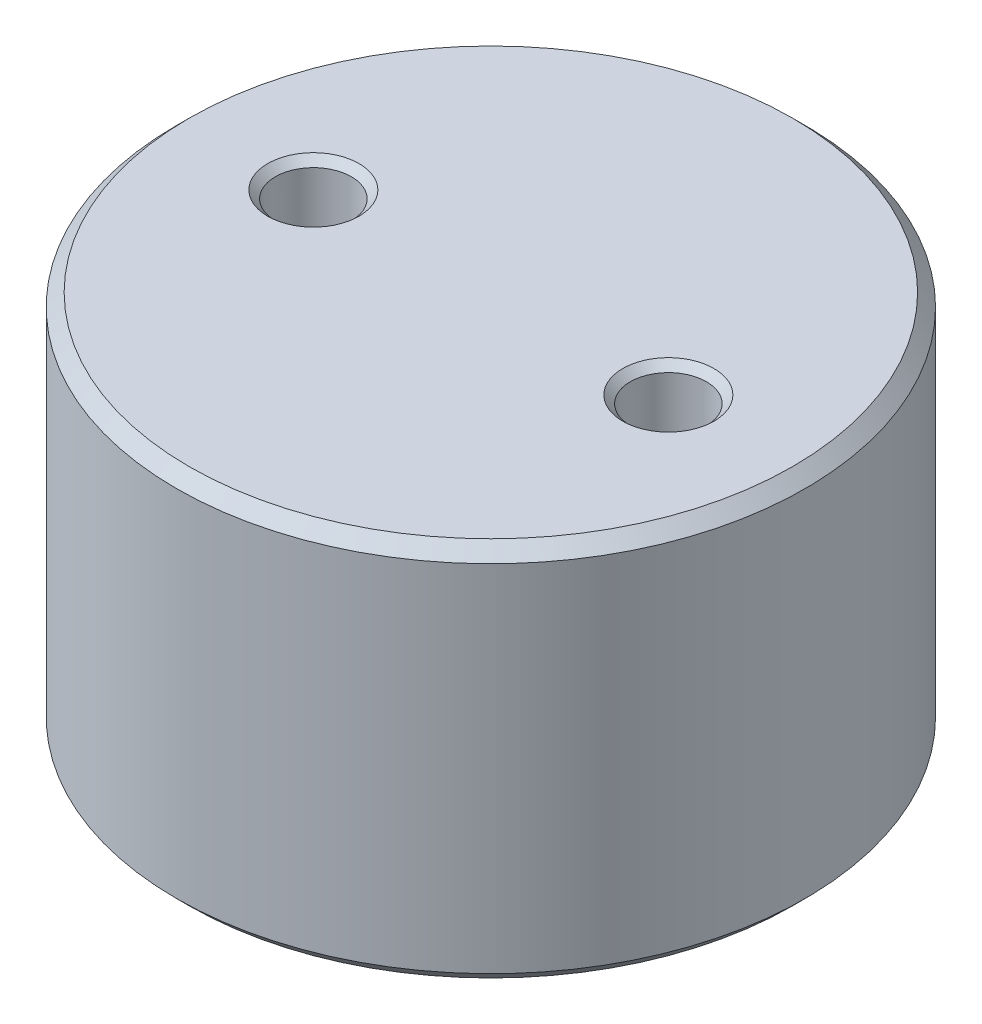
ISO-10303-21;
HEADER;
FILE_DESCRIPTION(('STEP AP214'),'2;1');
FILE_NAME('part.step','',(''),(''),'','','');
FILE_SCHEMA(('AUTOMOTIVE_DESIGN { 1 0 10303 214 1 1 1 1 }'));
ENDSEC;
DATA;
#1=APPLICATION_CONTEXT('core data for automotive mechanical design processes');
#2=APPLICATION_PROTOCOL_DEFINITION('international standard','automotive_design',2000,#1);
#3=PRODUCT_CONTEXT('',#1,'mechanical');
#4=PRODUCT('Part','Part','',(#3));
#5=PRODUCT_RELATED_PRODUCT_CATEGORY('part','',(#4));
#6=PRODUCT_DEFINITION_FORMATION('','',#4);
#7=PRODUCT_DEFINITION_CONTEXT('part definition',#1,'design');
#8=PRODUCT_DEFINITION('design','',#6,#7);
#9=PRODUCT_DEFINITION_SHAPE('','',#8);
#10=(LENGTH_UNIT() NAMED_UNIT(*) SI_UNIT(.MILLI.,.METRE.));
#11=(NAMED_UNIT(*) PLANE_ANGLE_UNIT() SI_UNIT($,.RADIAN.));
#12=(NAMED_UNIT(*) SI_UNIT($,.STERADIAN.) SOLID_ANGLE_UNIT());
#13=UNCERTAINTY_MEASURE_WITH_UNIT(LENGTH_MEASURE(1.E-05),#10,'distance_accuracy_value','');
#14=(GEOMETRIC_REPRESENTATION_CONTEXT(3) GLOBAL_UNCERTAINTY_ASSIGNED_CONTEXT((#13)) GLOBAL_UNIT_ASSIGNED_CONTEXT((#10,
#11,#12)) REPRESENTATION_CONTEXT('',''));
#15=CARTESIAN_POINT('',(0.,0.,0.));
#16=DIRECTION('',(0.,0.,1.));
#17=DIRECTION('',(1.,0.,0.));
#18=AXIS2_PLACEMENT_3D('',#15,#16,#17);
#19=CARTESIAN_POINT('',(-7.,14.85002066024,0.));
#20=DIRECTION('',(0.,1.,0.));
#21=DIRECTION('',(0.,0.,-1.));
#22=AXIS2_PLACEMENT_3D('',#19,#20,#21);
#23=CONICAL_SURFACE('',#22,1.649980063585,0.785385861382257);
#24=CARTESIAN_POINT('',(-7.,14.7000369064956,0.));
#25=DIRECTION('',(0.,-1.,0.));
#26=DIRECTION('',(1.,0.,0.));
#27=AXIS2_PLACEMENT_3D('',#24,#25,#26);
#28=CIRCLE('',#27,1.5);
#29=CARTESIAN_POINT('',(-8.5,14.7000369064956,0.));
#30=VERTEX_POINT('',#29);
#31=CARTESIAN_POINT('',(-7.,14.7000369064956,1.5));
#32=VERTEX_POINT('',#31);
#33=EDGE_CURVE('E152',#30,#32,#28,.T.);
#34=ORIENTED_EDGE('',*,*,#33,.T.);
#35=DIRECTION('',(0.,0.707115479971405,0.707098082294677));
#36=VECTOR('',#35,1.);
#37=CARTESIAN_POINT('',(-7.,14.85002066024,1.649980063585));
#38=LINE('',#37,#36);
#39=CARTESIAN_POINT('',(-7.,15.,1.79995571329416));
#40=VERTEX_POINT('',#39);
#41=EDGE_CURVE('E11',#32,#40,#38,.T.);
#42=ORIENTED_EDGE('',*,*,#41,.T.);
#43=CARTESIAN_POINT('',(-7.,15.,0.));
#44=DIRECTION('',(0.,-1.,0.));
#45=DIRECTION('',(0.,0.,-1.));
#46=AXIS2_PLACEMENT_3D('',#43,#44,#45);
#47=CIRCLE('',#46,1.79995571329416);
#48=EDGE_CURVE('E141',#40,#40,#47,.T.);
#49=ORIENTED_EDGE('',*,*,#48,.F.);
#50=ORIENTED_EDGE('',*,*,#41,.F.);
#51=CARTESIAN_POINT('',(-7.,14.7000369064956,0.));
#52=DIRECTION('',(0.,-1.,0.));
#53=DIRECTION('',(1.,0.,0.));
#54=AXIS2_PLACEMENT_3D('',#51,#52,#53);
#55=CIRCLE('',#54,1.5);
#56=EDGE_CURVE('E21',#32,#30,#55,.T.);
#57=ORIENTED_EDGE('',*,*,#56,.T.);
#58=EDGE_LOOP('',(#34,#42,#49,#50,#57));
#59=FACE_BOUND('',#58,.T.);
#60=ADVANCED_FACE('F17',(#59),#23,.F.);
#61=CARTESIAN_POINT('',(-7.,15.,0.));
#62=DIRECTION('',(0.,-1.,0.));
#63=DIRECTION('',(1.,0.,0.));
#64=AXIS2_PLACEMENT_3D('',#61,#62,#63);
#65=CYLINDRICAL_SURFACE('',#64,1.5);
#66=ORIENTED_EDGE('',*,*,#33,.F.);
#67=DIRECTION('',(0.,-1.,0.));
#68=VECTOR('',#67,1.);
#69=CARTESIAN_POINT('',(-8.5,15.,0.));
#70=LINE('',#69,#68);
#71=CARTESIAN_POINT('',(-8.5,12.,0.));
#72=VERTEX_POINT('',#71);
#73=EDGE_CURVE('E184',#30,#72,#70,.T.);
#74=ORIENTED_EDGE('',*,*,#73,.T.);
#75=CARTESIAN_POINT('',(-7.,12.,0.));
#76=DIRECTION('',(0.,-1.,0.));
#77=DIRECTION('',(-1.,0.,0.));
#78=AXIS2_PLACEMENT_3D('',#75,#76,#77);
#79=CIRCLE('',#78,1.5);
#80=EDGE_CURVE('E156',#72,#72,#79,.T.);
#81=ORIENTED_EDGE('',*,*,#80,.T.);
#82=ORIENTED_EDGE('',*,*,#73,.F.);
#83=ORIENTED_EDGE('',*,*,#56,.F.);
#84=EDGE_LOOP('',(#66,#74,#81,#82,#83));
#85=FACE_BOUND('',#84,.T.);
#86=ADVANCED_FACE('F270',(#85),#65,.F.);
#87=CARTESIAN_POINT('',(0.,0.,0.));
#88=DIRECTION('',(0.,1.,0.));
#89=DIRECTION('',(-1.,0.,0.));
#90=AXIS2_PLACEMENT_3D('',#87,#88,#89);
#91=CYLINDRICAL_SURFACE('',#90,8.5);
#92=CARTESIAN_POINT('',(0.,10.,0.));
#93=DIRECTION('',(0.,1.,0.));
#94=DIRECTION('',(-1.,0.,0.));
#95=AXIS2_PLACEMENT_3D('',#92,#93,#94);
#96=CIRCLE('',#95,8.5);
#97=CARTESIAN_POINT('',(8.5,10.,0.));
#98=VERTEX_POINT('',#97);
#99=EDGE_CURVE('E174',#98,#98,#96,.T.);
#100=ORIENTED_EDGE('',*,*,#99,.F.);
#101=DIRECTION('',(0.,1.,0.));
#102=VECTOR('',#101,1.);
#103=CARTESIAN_POINT('',(8.5,0.,0.));
#104=LINE('',#103,#102);
#105=CARTESIAN_POINT('',(8.5,12.,0.));
#106=VERTEX_POINT('',#105);
#107=EDGE_CURVE('E148',#98,#106,#104,.T.);
#108=ORIENTED_EDGE('',*,*,#107,.T.);
#109=CARTESIAN_POINT('',(0.,12.,0.));
#110=DIRECTION('',(0.,1.,0.));
#111=DIRECTION('',(1.,0.,0.));
#112=AXIS2_PLACEMENT_3D('',#109,#110,#111);
#113=CIRCLE('',#112,8.5);
#114=EDGE_CURVE('E153',#106,#72,#113,.T.);
#115=ORIENTED_EDGE('',*,*,#114,.T.);
#116=CARTESIAN_POINT('',(0.,12.,0.));
#117=DIRECTION('',(0.,1.,0.));
#118=DIRECTION('',(-1.,0.,0.));
#119=AXIS2_PLACEMENT_3D('',#116,#117,#118);
#120=CIRCLE('',#119,8.5);
#121=EDGE_CURVE('E169',#72,#106,#120,.T.);
#122=ORIENTED_EDGE('',*,*,#121,.T.);
#123=ORIENTED_EDGE('',*,*,#107,.F.);
#124=EDGE_LOOP('',(#100,#108,#115,#122,#123));
#125=FACE_BOUND('',#124,.T.);
#126=ADVANCED_FACE('F19',(#125),#91,.F.);
#127=CARTESIAN_POINT('',(0.,12.,0.));
#128=DIRECTION('',(0.,1.,0.));
#129=DIRECTION('',(1.,0.,0.));
#130=AXIS2_PLACEMENT_3D('',#127,#128,#129);
#131=PLANE('',#130);
#132=CARTESIAN_POINT('',(7.,12.,0.));
#133=DIRECTION('',(0.,-1.,0.));
#134=DIRECTION('',(-1.,0.,0.));
#135=AXIS2_PLACEMENT_3D('',#132,#133,#134);
#136=CIRCLE('',#135,1.5);
#137=CARTESIAN_POINT('',(5.5,12.,0.));
#138=VERTEX_POINT('',#137);
#139=EDGE_CURVE('E146',#106,#138,#136,.T.);
#140=ORIENTED_EDGE('',*,*,#139,.F.);
#141=ORIENTED_EDGE('',*,*,#121,.F.);
#142=ORIENTED_EDGE('',*,*,#80,.F.);
#143=ORIENTED_EDGE('',*,*,#114,.F.);
#144=CARTESIAN_POINT('',(7.,12.,0.));
#145=DIRECTION('',(0.,-1.,0.));
#146=DIRECTION('',(-1.,0.,0.));
#147=AXIS2_PLACEMENT_3D('',#144,#145,#146);
#148=CIRCLE('',#147,1.5);
#149=EDGE_CURVE('E142',#138,#106,#148,.T.);
#150=ORIENTED_EDGE('',*,*,#149,.F.);
#151=EDGE_LOOP('',(#140,#141,#142,#143,#150));
#152=FACE_BOUND('',#151,.T.);
#153=ADVANCED_FACE('F243',(#152),#131,.F.);
#154=CARTESIAN_POINT('',(7.,15.,0.));
#155=DIRECTION('',(0.,-1.,0.));
#156=DIRECTION('',(1.,0.,0.));
#157=AXIS2_PLACEMENT_3D('',#154,#155,#156);
#158=CYLINDRICAL_SURFACE('',#157,1.5);
#159=CARTESIAN_POINT('',(7.,14.7000369064956,0.));
#160=DIRECTION('',(0.,-1.,0.));
#161=DIRECTION('',(1.,0.,0.));
#162=AXIS2_PLACEMENT_3D('',#159,#160,#161);
#163=CIRCLE('',#162,1.5);
#164=CARTESIAN_POINT('',(5.5,14.7000369064956,0.));
#165=VERTEX_POINT('',#164);
#166=CARTESIAN_POINT('',(7.,14.7000369064956,1.5));
#167=VERTEX_POINT('',#166);
#168=EDGE_CURVE('E136',#165,#167,#163,.T.);
#169=ORIENTED_EDGE('',*,*,#168,.F.);
#170=DIRECTION('',(0.,-1.,0.));
#171=VECTOR('',#170,1.);
#172=CARTESIAN_POINT('',(5.5,15.,0.));
#173=LINE('',#172,#171);
#174=EDGE_CURVE('E147',#165,#138,#173,.T.);
#175=ORIENTED_EDGE('',*,*,#174,.T.);
#176=ORIENTED_EDGE('',*,*,#149,.T.);
#177=ORIENTED_EDGE('',*,*,#139,.T.);
#178=ORIENTED_EDGE('',*,*,#174,.F.);
#179=CARTESIAN_POINT('',(7.,14.7000369064956,0.));
#180=DIRECTION('',(0.,-1.,0.));
#181=DIRECTION('',(1.,0.,0.));
#182=AXIS2_PLACEMENT_3D('',#179,#180,#181);
#183=CIRCLE('',#182,1.5);
#184=EDGE_CURVE('E160',#167,#165,#183,.T.);
#185=ORIENTED_EDGE('',*,*,#184,.F.);
#186=EDGE_LOOP('',(#169,#175,#176,#177,#178,#185));
#187=FACE_BOUND('',#186,.T.);
#188=ADVANCED_FACE('F247',(#187),#158,.F.);
#189=CARTESIAN_POINT('',(7.,14.85002066024,0.));
#190=DIRECTION('',(0.,1.,0.));
#191=DIRECTION('',(0.,0.,-1.));
#192=AXIS2_PLACEMENT_3D('',#189,#190,#191);
#193=CONICAL_SURFACE('',#192,1.649980063585,0.785385861382257);
#194=ORIENTED_EDGE('',*,*,#168,.T.);
#195=DIRECTION('',(0.,0.707115479971405,0.707098082294677));
#196=VECTOR('',#195,1.);
#197=CARTESIAN_POINT('',(7.,14.85002066024,1.649980063585));
#198=LINE('',#197,#196);
#199=CARTESIAN_POINT('',(7.,15.,1.79995571329416));
#200=VERTEX_POINT('',#199);
#201=EDGE_CURVE('E140',#167,#200,#198,.T.);
#202=ORIENTED_EDGE('',*,*,#201,.T.);
#203=CARTESIAN_POINT('',(7.,15.,0.));
#204=DIRECTION('',(0.,-1.,0.));
#205=DIRECTION('',(0.,0.,-1.));
#206=AXIS2_PLACEMENT_3D('',#203,#204,#205);
#207=CIRCLE('',#206,1.79995571329416);
#208=EDGE_CURVE('E178',#200,#200,#207,.T.);
#209=ORIENTED_EDGE('',*,*,#208,.F.);
#210=ORIENTED_EDGE('',*,*,#201,.F.);
#211=ORIENTED_EDGE('',*,*,#184,.T.);
#212=EDGE_LOOP('',(#194,#202,#209,#210,#211));
#213=FACE_BOUND('',#212,.T.);
#214=ADVANCED_FACE('F252',(#213),#193,.F.);
#215=CARTESIAN_POINT('',(0.,15.,0.));
#216=DIRECTION('',(0.,1.,0.));
#217=DIRECTION('',(1.,0.,0.));
#218=AXIS2_PLACEMENT_3D('',#215,#216,#217);
#219=PLANE('',#218);
#220=ORIENTED_EDGE('',*,*,#48,.T.);
#221=EDGE_LOOP('',(#220));
#222=FACE_BOUND('',#221,.T.);
#223=ORIENTED_EDGE('',*,*,#208,.T.);
#224=EDGE_LOOP('',(#223));
#225=FACE_BOUND('',#224,.T.);
#226=CARTESIAN_POINT('',(0.,14.99999947595,0.));
#227=DIRECTION('',(0.,1.,0.));
#228=DIRECTION('',(-1.,0.,0.));
#229=AXIS2_PLACEMENT_3D('',#226,#227,#228);
#230=CIRCLE('',#229,11.89999843137);
#231=CARTESIAN_POINT('',(0.,14.9999994759471,11.899998431367));
#232=VERTEX_POINT('',#231);
#233=EDGE_CURVE('E180',#232,#232,#230,.T.);
#234=ORIENTED_EDGE('',*,*,#233,.T.);
#235=EDGE_LOOP('',(#234));
#236=FACE_BOUND('',#235,.T.);
#237=ADVANCED_FACE('F255',(#222,#225,#236),#219,.T.);
#238=CARTESIAN_POINT('',(0.,14.7499987344,0.));
#239=DIRECTION('',(0.,-1.,0.));
#240=DIRECTION('',(0.,0.,-1.));
#241=AXIS2_PLACEMENT_3D('',#238,#239,#240);
#242=CONICAL_SURFACE('',#241,12.14999912895,0.785398075469506);
#243=CARTESIAN_POINT('',(0.,14.49999890158,0.));
#244=DIRECTION('',(0.,1.,0.));
#245=DIRECTION('',(1.,0.,0.));
#246=AXIS2_PLACEMENT_3D('',#243,#244,#245);
#247=CIRCLE('',#246,12.4);
#248=CARTESIAN_POINT('',(0.,14.499998360483,12.3999994589029));
#249=VERTEX_POINT('',#248);
#250=CARTESIAN_POINT('',(-12.4,14.49999890158,0.));
#251=VERTEX_POINT('',#250);
#252=EDGE_CURVE('E112',#249,#251,#247,.T.);
#253=ORIENTED_EDGE('',*,*,#252,.T.);
#254=CARTESIAN_POINT('',(0.,14.49999890158,0.));
#255=DIRECTION('',(0.,1.,0.));
#256=DIRECTION('',(1.,0.,0.));
#257=AXIS2_PLACEMENT_3D('',#254,#255,#256);
#258=CIRCLE('',#257,12.4);
#259=EDGE_CURVE('E119',#251,#249,#258,.T.);
#260=ORIENTED_EDGE('',*,*,#259,.T.);
#261=DIRECTION('',(0.,0.707106843360989,-0.7071067190121));
#262=VECTOR('',#261,1.);
#263=CARTESIAN_POINT('',(0.,14.7499987344,12.14999912895));
#264=LINE('',#263,#262);
#265=EDGE_CURVE('E118',#249,#232,#264,.T.);
#266=ORIENTED_EDGE('',*,*,#265,.T.);
#267=ORIENTED_EDGE('',*,*,#233,.F.);
#268=ORIENTED_EDGE('',*,*,#265,.F.);
#269=EDGE_LOOP('',(#253,#260,#266,#267,#268));
#270=FACE_BOUND('',#269,.T.);
#271=ADVANCED_FACE('F126',(#270),#242,.T.);
#272=CARTESIAN_POINT('',(0.,-0.75,0.));
#273=DIRECTION('',(0.,1.,0.));
#274=DIRECTION('',(1.,0.,0.));
#275=AXIS2_PLACEMENT_3D('',#272,#273,#274);
#276=CYLINDRICAL_SURFACE('',#275,12.4);
#277=ORIENTED_EDGE('',*,*,#252,.F.);
#278=ORIENTED_EDGE('',*,*,#259,.F.);
#279=DIRECTION('',(0.,-1.,0.));
#280=VECTOR('',#279,1.);
#281=CARTESIAN_POINT('',(-12.4,-0.75,0.));
#282=LINE('',#281,#280);
#283=CARTESIAN_POINT('',(-12.4,0.5000008936729,0.));
#284=VERTEX_POINT('',#283);
#285=EDGE_CURVE('E108',#251,#284,#282,.T.);
#286=ORIENTED_EDGE('',*,*,#285,.T.);
#287=CARTESIAN_POINT('',(0.,0.5000008936729,0.));
#288=DIRECTION('',(0.,1.,0.));
#289=DIRECTION('',(1.,0.,0.));
#290=AXIS2_PLACEMENT_3D('',#287,#288,#289);
#291=CIRCLE('',#290,12.4);
#292=CARTESIAN_POINT('',(0.,0.50000141255246,12.3999994811204));
#293=VERTEX_POINT('',#292);
#294=EDGE_CURVE('E204',#284,#293,#291,.T.);
#295=ORIENTED_EDGE('',*,*,#294,.T.);
#296=CARTESIAN_POINT('',(0.,0.5000008936729,0.));
#297=DIRECTION('',(0.,1.,0.));
#298=DIRECTION('',(1.,0.,0.));
#299=AXIS2_PLACEMENT_3D('',#296,#297,#298);
#300=CIRCLE('',#299,12.4);
#301=EDGE_CURVE('E115',#293,#284,#300,.T.);
#302=ORIENTED_EDGE('',*,*,#301,.T.);
#303=ORIENTED_EDGE('',*,*,#285,.F.);
#304=EDGE_LOOP('',(#277,#278,#286,#295,#302,#303));
#305=FACE_BOUND('',#304,.T.);
#306=ADVANCED_FACE('F110',(#305),#276,.T.);
#307=CARTESIAN_POINT('',(0.,0.2500010929219,0.));
#308=DIRECTION('',(0.,1.,0.));
#309=DIRECTION('',(0.,0.,-1.));
#310=AXIS2_PLACEMENT_3D('',#307,#308,#309);
#311=CONICAL_SURFACE('',#310,12.14999920043,0.785398085517192);
#312=ORIENTED_EDGE('',*,*,#294,.F.);
#313=ORIENTED_EDGE('',*,*,#301,.F.);
#314=DIRECTION('',(0.,-0.707106836256203,-0.707106726116888));
#315=VECTOR('',#314,1.);
#316=CARTESIAN_POINT('',(0.,0.2500010929219,12.14999920043));
#317=LINE('',#316,#315);
#318=CARTESIAN_POINT('',(0.,5.01850348152977E-07,11.8999986482986));
#319=VERTEX_POINT('',#318);
#320=EDGE_CURVE('E129',#293,#319,#317,.T.);
#321=ORIENTED_EDGE('',*,*,#320,.T.);
#322=CARTESIAN_POINT('',(0.,5.018490156772E-07,0.));
#323=DIRECTION('',(0.,1.,0.));
#324=DIRECTION('',(1.,0.,0.));
#325=AXIS2_PLACEMENT_3D('',#322,#323,#324);
#326=CIRCLE('',#325,11.8999986483);
#327=EDGE_CURVE('E165',#319,#319,#326,.T.);
#328=ORIENTED_EDGE('',*,*,#327,.T.);
#329=ORIENTED_EDGE('',*,*,#320,.F.);
#330=EDGE_LOOP('',(#312,#313,#321,#328,#329));
#331=FACE_BOUND('',#330,.T.);
#332=ADVANCED_FACE('F293',(#331),#311,.T.);
#333=CARTESIAN_POINT('',(0.,0.,0.));
#334=DIRECTION('',(0.,1.,0.));
#335=DIRECTION('',(1.,0.,0.));
#336=AXIS2_PLACEMENT_3D('',#333,#334,#335);
#337=PLANE('',#336);
#338=CARTESIAN_POINT('',(0.,2.029243850288E-06,0.));
#339=DIRECTION('',(0.,1.,0.));
#340=DIRECTION('',(-1.,0.,0.));
#341=AXIS2_PLACEMENT_3D('',#338,#339,#340);
#342=CIRCLE('',#341,10.50000033908);
#343=CARTESIAN_POINT('',(0.,2.02924307534519E-06,10.5000003390792));
#344=VERTEX_POINT('',#343);
#345=EDGE_CURVE('E162',#344,#344,#342,.T.);
#346=ORIENTED_EDGE('',*,*,#345,.T.);
#347=EDGE_LOOP('',(#346));
#348=FACE_BOUND('',#347,.T.);
#349=ORIENTED_EDGE('',*,*,#327,.F.);
#350=EDGE_LOOP('',(#349));
#351=FACE_BOUND('',#350,.T.);
#352=ADVANCED_FACE('F289',(#348,#351),#337,.F.);
#353=CARTESIAN_POINT('',(0.,0.2500010801838,0.));
#354=DIRECTION('',(0.,-1.,0.));
#355=DIRECTION('',(0.,0.,-1.));
#356=AXIS2_PLACEMENT_3D('',#353,#354,#355);
#357=CONICAL_SURFACE('',#356,10.25000123175,0.785398276174865);
#358=CARTESIAN_POINT('',(0.,0.500002255544821,0.));
#359=DIRECTION('',(0.,1.,0.));
#360=DIRECTION('',(1.,0.,0.));
#361=AXIS2_PLACEMENT_3D('',#358,#359,#360);
#362=CIRCLE('',#361,10.);
#363=CARTESIAN_POINT('',(0.,0.500002255544836,10.));
#364=VERTEX_POINT('',#363);
#365=CARTESIAN_POINT('',(-10.,0.500002255544821,0.));
#366=VERTEX_POINT('',#365);
#367=EDGE_CURVE('E211',#364,#366,#362,.T.);
#368=ORIENTED_EDGE('',*,*,#367,.T.);
#369=CARTESIAN_POINT('',(0.,0.500002255544821,0.));
#370=DIRECTION('',(0.,1.,0.));
#371=DIRECTION('',(1.,0.,0.));
#372=AXIS2_PLACEMENT_3D('',#369,#370,#371);
#373=CIRCLE('',#372,10.);
#374=EDGE_CURVE('E199',#366,#364,#373,.T.);
#375=ORIENTED_EDGE('',*,*,#374,.T.);
#376=DIRECTION('',(0.,-0.707106701440867,0.707106860932219));
#377=VECTOR('',#376,1.);
#378=CARTESIAN_POINT('',(0.,0.2500010801838,10.25000123175));
#379=LINE('',#378,#377);
#380=EDGE_CURVE('E166',#364,#344,#379,.T.);
#381=ORIENTED_EDGE('',*,*,#380,.T.);
#382=ORIENTED_EDGE('',*,*,#345,.F.);
#383=ORIENTED_EDGE('',*,*,#380,.F.);
#384=EDGE_LOOP('',(#368,#375,#381,#382,#383));
#385=FACE_BOUND('',#384,.T.);
#386=ADVANCED_FACE('F292',(#385),#357,.F.);
#387=CARTESIAN_POINT('',(0.,-0.75,0.));
#388=DIRECTION('',(0.,1.,0.));
#389=DIRECTION('',(1.,0.,0.));
#390=AXIS2_PLACEMENT_3D('',#387,#388,#389);
#391=CYLINDRICAL_SURFACE('',#390,10.);
#392=ORIENTED_EDGE('',*,*,#367,.F.);
#393=ORIENTED_EDGE('',*,*,#374,.F.);
#394=DIRECTION('',(0.,1.,0.));
#395=VECTOR('',#394,1.);
#396=CARTESIAN_POINT('',(-10.,-0.75,0.));
#397=LINE('',#396,#395);
#398=CARTESIAN_POINT('',(-10.,10.,0.));
#399=VERTEX_POINT('',#398);
#400=EDGE_CURVE('E196',#366,#399,#397,.T.);
#401=ORIENTED_EDGE('',*,*,#400,.T.);
#402=CARTESIAN_POINT('',(0.,10.,0.));
#403=DIRECTION('',(0.,-1.,0.));
#404=DIRECTION('',(1.,0.,0.));
#405=AXIS2_PLACEMENT_3D('',#402,#403,#404);
#406=CIRCLE('',#405,10.);
#407=EDGE_CURVE('E170',#399,#399,#406,.T.);
#408=ORIENTED_EDGE('',*,*,#407,.F.);
#409=ORIENTED_EDGE('',*,*,#400,.F.);
#410=EDGE_LOOP('',(#392,#393,#401,#408,#409));
#411=FACE_BOUND('',#410,.T.);
#412=ADVANCED_FACE('F278',(#411),#391,.F.);
#413=CARTESIAN_POINT('',(0.,10.,0.));
#414=DIRECTION('',(0.,1.,0.));
#415=DIRECTION('',(1.,0.,0.));
#416=AXIS2_PLACEMENT_3D('',#413,#414,#415);
#417=PLANE('',#416);
#418=ORIENTED_EDGE('',*,*,#99,.T.);
#419=EDGE_LOOP('',(#418));
#420=FACE_BOUND('',#419,.T.);
#421=ORIENTED_EDGE('',*,*,#407,.T.);
#422=EDGE_LOOP('',(#421));
#423=FACE_BOUND('',#422,.T.);
#424=ADVANCED_FACE('F231',(#420,#423),#417,.F.);
#425=CLOSED_SHELL('',(#60,#86,#126,#153,#188,#214,#237,#271,#306,#332,#352,#386,#412,#424));
#426=MANIFOLD_SOLID_BREP('B1',#425);
#427=ADVANCED_BREP_SHAPE_REPRESENTATION('',(#18,#426),#14);
#428=SHAPE_DEFINITION_REPRESENTATION(#9,#427);
ENDSEC;
END-ISO-10303-21;
